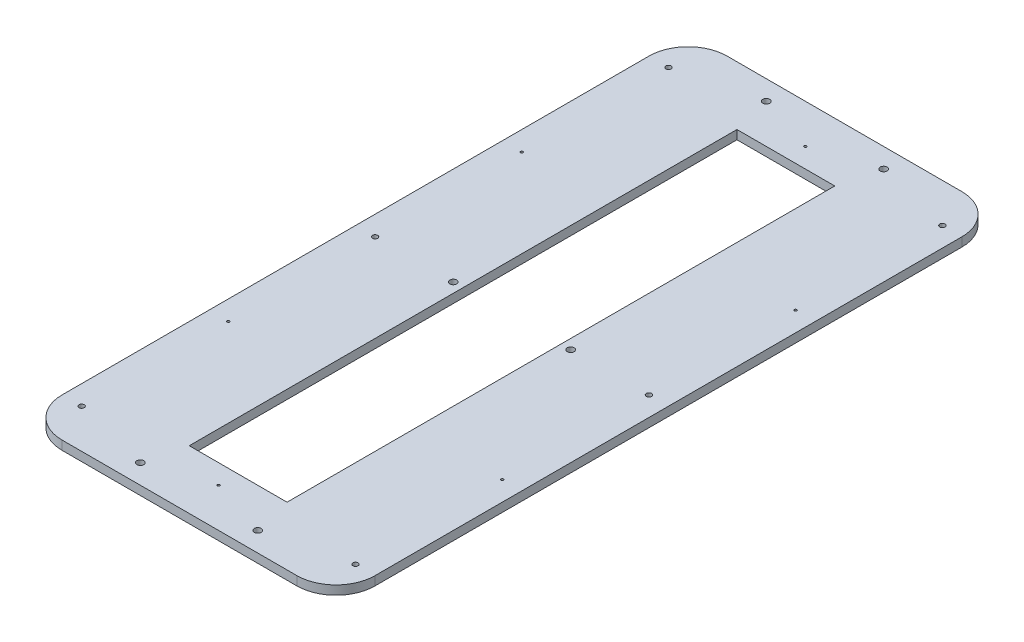
ISO-10303-21;
HEADER;
FILE_DESCRIPTION(('STEP AP214'),'2;1');
FILE_NAME('part.step','',(''),(''),'','','');
FILE_SCHEMA(('AUTOMOTIVE_DESIGN { 1 0 10303 214 1 1 1 1 }'));
ENDSEC;
DATA;
#1=APPLICATION_CONTEXT('core data for automotive mechanical design processes');
#2=APPLICATION_PROTOCOL_DEFINITION('international standard','automotive_design',2000,#1);
#3=PRODUCT_CONTEXT('',#1,'mechanical');
#4=PRODUCT('Part','Part','',(#3));
#5=PRODUCT_RELATED_PRODUCT_CATEGORY('part','',(#4));
#6=PRODUCT_DEFINITION_FORMATION('','',#4);
#7=PRODUCT_DEFINITION_CONTEXT('part definition',#1,'design');
#8=PRODUCT_DEFINITION('design','',#6,#7);
#9=PRODUCT_DEFINITION_SHAPE('','',#8);
#10=(LENGTH_UNIT() NAMED_UNIT(*) SI_UNIT(.MILLI.,.METRE.));
#11=(NAMED_UNIT(*) PLANE_ANGLE_UNIT() SI_UNIT($,.RADIAN.));
#12=(NAMED_UNIT(*) SI_UNIT($,.STERADIAN.) SOLID_ANGLE_UNIT());
#13=UNCERTAINTY_MEASURE_WITH_UNIT(LENGTH_MEASURE(1.E-05),#10,'distance_accuracy_value','');
#14=(GEOMETRIC_REPRESENTATION_CONTEXT(3) GLOBAL_UNCERTAINTY_ASSIGNED_CONTEXT((#13)) GLOBAL_UNIT_ASSIGNED_CONTEXT((#10,
#11,#12)) REPRESENTATION_CONTEXT('',''));
#15=CARTESIAN_POINT('',(0.,0.,0.));
#16=DIRECTION('',(0.,0.,1.));
#17=DIRECTION('',(1.,0.,0.));
#18=AXIS2_PLACEMENT_3D('',#15,#16,#17);
#19=CARTESIAN_POINT('',(0.,5.8,0.));
#20=DIRECTION('',(1.,0.,0.));
#21=DIRECTION('',(0.,0.,-1.));
#22=AXIS2_PLACEMENT_3D('',#19,#20,#21);
#23=PLANE('',#22);
#24=DIRECTION('',(0.,0.,1.));
#25=VECTOR('',#24,1.);
#26=CARTESIAN_POINT('',(0.,5.8,0.));
#27=LINE('',#26,#25);
#28=CARTESIAN_POINT('',(0.,5.8,-406.4));
#29=VERTEX_POINT('',#28);
#30=CARTESIAN_POINT('',(0.,5.8,-25.4));
#31=VERTEX_POINT('',#30);
#32=EDGE_CURVE('E197',#29,#31,#27,.T.);
#33=ORIENTED_EDGE('',*,*,#32,.F.);
#34=DIRECTION('',(0.,-1.,0.));
#35=VECTOR('',#34,1.);
#36=CARTESIAN_POINT('',(0.,5.8,-406.4));
#37=LINE('',#36,#35);
#38=CARTESIAN_POINT('',(0.,0.,-406.4));
#39=VERTEX_POINT('',#38);
#40=EDGE_CURVE('E254',#29,#39,#37,.T.);
#41=ORIENTED_EDGE('',*,*,#40,.T.);
#42=DIRECTION('',(0.,0.,1.));
#43=VECTOR('',#42,1.);
#44=CARTESIAN_POINT('',(0.,0.,0.));
#45=LINE('',#44,#43);
#46=CARTESIAN_POINT('',(0.,0.,-25.4));
#47=VERTEX_POINT('',#46);
#48=EDGE_CURVE('E196',#39,#47,#45,.T.);
#49=ORIENTED_EDGE('',*,*,#48,.T.);
#50=DIRECTION('',(0.,-1.,0.));
#51=VECTOR('',#50,1.);
#52=CARTESIAN_POINT('',(0.,5.8,-25.4));
#53=LINE('',#52,#51);
#54=EDGE_CURVE('E252',#47,#31,#53,.F.);
#55=ORIENTED_EDGE('',*,*,#54,.T.);
#56=EDGE_LOOP('',(#33,#41,#49,#55));
#57=FACE_BOUND('',#56,.T.);
#58=ADVANCED_FACE('F32',(#57),#23,.F.);
#59=CARTESIAN_POINT('',(0.,5.8,0.));
#60=DIRECTION('',(0.,0.,-1.));
#61=DIRECTION('',(-1.,0.,0.));
#62=AXIS2_PLACEMENT_3D('',#59,#60,#61);
#63=PLANE('',#62);
#64=DIRECTION('',(1.,0.,0.));
#65=VECTOR('',#64,1.);
#66=CARTESIAN_POINT('',(0.,0.,0.));
#67=LINE('',#66,#65);
#68=CARTESIAN_POINT('',(25.4,0.,0.));
#69=VERTEX_POINT('',#68);
#70=CARTESIAN_POINT('',(177.8,0.,0.));
#71=VERTEX_POINT('',#70);
#72=EDGE_CURVE('E211',#69,#71,#67,.T.);
#73=ORIENTED_EDGE('',*,*,#72,.T.);
#74=DIRECTION('',(0.,-1.,0.));
#75=VECTOR('',#74,1.);
#76=CARTESIAN_POINT('',(177.8,5.8,0.));
#77=LINE('',#76,#75);
#78=CARTESIAN_POINT('',(177.8,5.8,0.));
#79=VERTEX_POINT('',#78);
#80=EDGE_CURVE('E11',#71,#79,#77,.F.);
#81=ORIENTED_EDGE('',*,*,#80,.T.);
#82=DIRECTION('',(1.,0.,0.));
#83=VECTOR('',#82,1.);
#84=CARTESIAN_POINT('',(0.,5.8,0.));
#85=LINE('',#84,#83);
#86=CARTESIAN_POINT('',(25.4,5.8,0.));
#87=VERTEX_POINT('',#86);
#88=EDGE_CURVE('E199',#87,#79,#85,.T.);
#89=ORIENTED_EDGE('',*,*,#88,.F.);
#90=DIRECTION('',(0.,-1.,0.));
#91=VECTOR('',#90,1.);
#92=CARTESIAN_POINT('',(25.4,5.8,0.));
#93=LINE('',#92,#91);
#94=EDGE_CURVE('E41',#87,#69,#93,.T.);
#95=ORIENTED_EDGE('',*,*,#94,.T.);
#96=EDGE_LOOP('',(#73,#81,#89,#95));
#97=FACE_BOUND('',#96,.T.);
#98=ADVANCED_FACE('F342',(#97),#63,.F.);
#99=CARTESIAN_POINT('',(203.2,5.8,0.));
#100=DIRECTION('',(-1.,0.,0.));
#101=DIRECTION('',(0.,0.,1.));
#102=AXIS2_PLACEMENT_3D('',#99,#100,#101);
#103=PLANE('',#102);
#104=DIRECTION('',(0.,0.,-1.));
#105=VECTOR('',#104,1.);
#106=CARTESIAN_POINT('',(203.2,0.,0.));
#107=LINE('',#106,#105);
#108=CARTESIAN_POINT('',(203.2,0.,-25.4));
#109=VERTEX_POINT('',#108);
#110=CARTESIAN_POINT('',(203.2,0.,-406.4));
#111=VERTEX_POINT('',#110);
#112=EDGE_CURVE('E213',#109,#111,#107,.T.);
#113=ORIENTED_EDGE('',*,*,#112,.T.);
#114=DIRECTION('',(0.,-1.,0.));
#115=VECTOR('',#114,1.);
#116=CARTESIAN_POINT('',(203.2,5.8,-406.4));
#117=LINE('',#116,#115);
#118=CARTESIAN_POINT('',(203.2,5.8,-406.4));
#119=VERTEX_POINT('',#118);
#120=EDGE_CURVE('E243',#111,#119,#117,.F.);
#121=ORIENTED_EDGE('',*,*,#120,.T.);
#122=DIRECTION('',(0.,0.,-1.));
#123=VECTOR('',#122,1.);
#124=CARTESIAN_POINT('',(203.2,5.8,0.));
#125=LINE('',#124,#123);
#126=CARTESIAN_POINT('',(203.2,5.8,-25.4));
#127=VERTEX_POINT('',#126);
#128=EDGE_CURVE('E202',#127,#119,#125,.T.);
#129=ORIENTED_EDGE('',*,*,#128,.F.);
#130=DIRECTION('',(0.,-1.,0.));
#131=VECTOR('',#130,1.);
#132=CARTESIAN_POINT('',(203.2,5.8,-25.4));
#133=LINE('',#132,#131);
#134=EDGE_CURVE('E240',#127,#109,#133,.T.);
#135=ORIENTED_EDGE('',*,*,#134,.T.);
#136=EDGE_LOOP('',(#113,#121,#129,#135));
#137=FACE_BOUND('',#136,.T.);
#138=ADVANCED_FACE('F345',(#137),#103,.F.);
#139=CARTESIAN_POINT('',(0.,5.8,-431.8));
#140=DIRECTION('',(0.,0.,1.));
#141=DIRECTION('',(1.,0.,0.));
#142=AXIS2_PLACEMENT_3D('',#139,#140,#141);
#143=PLANE('',#142);
#144=DIRECTION('',(-1.,0.,0.));
#145=VECTOR('',#144,1.);
#146=CARTESIAN_POINT('',(0.,5.8,-431.8));
#147=LINE('',#146,#145);
#148=CARTESIAN_POINT('',(177.8,5.8,-431.8));
#149=VERTEX_POINT('',#148);
#150=CARTESIAN_POINT('',(25.4,5.8,-431.8));
#151=VERTEX_POINT('',#150);
#152=EDGE_CURVE('E205',#149,#151,#147,.T.);
#153=ORIENTED_EDGE('',*,*,#152,.F.);
#154=DIRECTION('',(0.,-1.,0.));
#155=VECTOR('',#154,1.);
#156=CARTESIAN_POINT('',(177.8,5.8,-431.8));
#157=LINE('',#156,#155);
#158=CARTESIAN_POINT('',(177.8,0.,-431.8));
#159=VERTEX_POINT('',#158);
#160=EDGE_CURVE('E229',#149,#159,#157,.T.);
#161=ORIENTED_EDGE('',*,*,#160,.T.);
#162=DIRECTION('',(-1.,0.,0.));
#163=VECTOR('',#162,1.);
#164=CARTESIAN_POINT('',(0.,0.,-431.8));
#165=LINE('',#164,#163);
#166=CARTESIAN_POINT('',(25.4,0.,-431.8));
#167=VERTEX_POINT('',#166);
#168=EDGE_CURVE('E200',#159,#167,#165,.T.);
#169=ORIENTED_EDGE('',*,*,#168,.T.);
#170=DIRECTION('',(0.,-1.,0.));
#171=VECTOR('',#170,1.);
#172=CARTESIAN_POINT('',(25.4,5.8,-431.8));
#173=LINE('',#172,#171);
#174=EDGE_CURVE('E208',#167,#151,#173,.F.);
#175=ORIENTED_EDGE('',*,*,#174,.T.);
#176=EDGE_LOOP('',(#153,#161,#169,#175));
#177=FACE_BOUND('',#176,.T.);
#178=ADVANCED_FACE('F300',(#177),#143,.F.);
#179=CARTESIAN_POINT('',(0.,5.8,-431.8));
#180=DIRECTION('',(0.,-1.,0.));
#181=DIRECTION('',(0.,0.,-1.));
#182=AXIS2_PLACEMENT_3D('',#179,#180,#181);
#183=PLANE('',#182);
#184=CARTESIAN_POINT('',(190.5,5.8,-311.15));
#185=DIRECTION('',(0.,1.,0.));
#186=DIRECTION('',(0.,0.,-1.));
#187=AXIS2_PLACEMENT_3D('',#184,#185,#186);
#188=CIRCLE('',#187,0.793750000000054);
#189=CARTESIAN_POINT('',(190.5,5.8,-311.94375));
#190=VERTEX_POINT('',#189);
#191=EDGE_CURVE('E502',#190,#190,#188,.T.);
#192=ORIENTED_EDGE('',*,*,#191,.F.);
#193=EDGE_LOOP('',(#192));
#194=FACE_BOUND('',#193,.T.);
#195=CARTESIAN_POINT('',(12.6999999999999,5.8,-311.15));
#196=DIRECTION('',(0.,1.,0.));
#197=DIRECTION('',(0.,0.,-1.));
#198=AXIS2_PLACEMENT_3D('',#195,#196,#197);
#199=CIRCLE('',#198,0.793750000000021);
#200=CARTESIAN_POINT('',(12.6999999999999,5.8,-311.94375));
#201=VERTEX_POINT('',#200);
#202=EDGE_CURVE('E504',#201,#201,#199,.T.);
#203=ORIENTED_EDGE('',*,*,#202,.F.);
#204=EDGE_LOOP('',(#203));
#205=FACE_BOUND('',#204,.T.);
#206=CARTESIAN_POINT('',(101.6,5.8,-406.4));
#207=DIRECTION('',(0.,1.,0.));
#208=DIRECTION('',(0.,0.,-1.));
#209=AXIS2_PLACEMENT_3D('',#206,#207,#208);
#210=CIRCLE('',#209,0.793750000000027);
#211=CARTESIAN_POINT('',(101.6,5.8,-407.19375));
#212=VERTEX_POINT('',#211);
#213=EDGE_CURVE('E508',#212,#212,#210,.T.);
#214=ORIENTED_EDGE('',*,*,#213,.F.);
#215=EDGE_LOOP('',(#214));
#216=FACE_BOUND('',#215,.T.);
#217=CARTESIAN_POINT('',(101.6,5.8,-25.4));
#218=DIRECTION('',(0.,1.,0.));
#219=DIRECTION('',(0.,0.,1.));
#220=AXIS2_PLACEMENT_3D('',#217,#218,#219);
#221=CIRCLE('',#220,0.793749999999993);
#222=CARTESIAN_POINT('',(101.6,5.8,-24.60625));
#223=VERTEX_POINT('',#222);
#224=EDGE_CURVE('E512',#223,#223,#221,.T.);
#225=ORIENTED_EDGE('',*,*,#224,.F.);
#226=EDGE_LOOP('',(#225));
#227=FACE_BOUND('',#226,.T.);
#228=CARTESIAN_POINT('',(12.6999999999999,5.8,-120.65));
#229=DIRECTION('',(0.,1.,0.));
#230=DIRECTION('',(0.,0.,1.));
#231=AXIS2_PLACEMENT_3D('',#228,#229,#230);
#232=CIRCLE('',#231,0.793749999999999);
#233=CARTESIAN_POINT('',(12.6999999999999,5.8,-119.85625));
#234=VERTEX_POINT('',#233);
#235=EDGE_CURVE('E516',#234,#234,#232,.T.);
#236=ORIENTED_EDGE('',*,*,#235,.F.);
#237=EDGE_LOOP('',(#236));
#238=FACE_BOUND('',#237,.T.);
#239=CARTESIAN_POINT('',(190.5,5.8,-120.65));
#240=DIRECTION('',(0.,1.,0.));
#241=DIRECTION('',(0.,0.,1.));
#242=AXIS2_PLACEMENT_3D('',#239,#240,#241);
#243=CIRCLE('',#242,0.793750000000019);
#244=CARTESIAN_POINT('',(190.5,5.8,-119.85625));
#245=VERTEX_POINT('',#244);
#246=EDGE_CURVE('E520',#245,#245,#243,.T.);
#247=ORIENTED_EDGE('',*,*,#246,.F.);
#248=EDGE_LOOP('',(#247));
#249=FACE_BOUND('',#248,.T.);
#250=CARTESIAN_POINT('',(190.5,5.8,-406.4));
#251=DIRECTION('',(0.,1.,0.));
#252=DIRECTION('',(0.,0.,1.));
#253=AXIS2_PLACEMENT_3D('',#250,#251,#252);
#254=CIRCLE('',#253,1.70000000000001);
#255=CARTESIAN_POINT('',(190.5,5.8,-404.7));
#256=VERTEX_POINT('',#255);
#257=EDGE_CURVE('E281',#256,#256,#254,.T.);
#258=ORIENTED_EDGE('',*,*,#257,.F.);
#259=EDGE_LOOP('',(#258));
#260=FACE_BOUND('',#259,.T.);
#261=CARTESIAN_POINT('',(190.5,5.8,-25.4));
#262=DIRECTION('',(0.,1.,0.));
#263=DIRECTION('',(0.,0.,1.));
#264=AXIS2_PLACEMENT_3D('',#261,#262,#263);
#265=CIRCLE('',#264,1.70000000000001);
#266=CARTESIAN_POINT('',(190.5,5.8,-23.7));
#267=VERTEX_POINT('',#266);
#268=EDGE_CURVE('E271',#267,#267,#265,.T.);
#269=ORIENTED_EDGE('',*,*,#268,.F.);
#270=EDGE_LOOP('',(#269));
#271=FACE_BOUND('',#270,.T.);
#272=CARTESIAN_POINT('',(12.7,5.8,-25.4));
#273=DIRECTION('',(0.,1.,0.));
#274=DIRECTION('',(0.,0.,1.));
#275=AXIS2_PLACEMENT_3D('',#272,#273,#274);
#276=CIRCLE('',#275,1.7);
#277=CARTESIAN_POINT('',(12.7,5.8,-23.7));
#278=VERTEX_POINT('',#277);
#279=EDGE_CURVE('E268',#278,#278,#276,.T.);
#280=ORIENTED_EDGE('',*,*,#279,.F.);
#281=EDGE_LOOP('',(#280));
#282=FACE_BOUND('',#281,.T.);
#283=CARTESIAN_POINT('',(12.7,5.8,-406.4));
#284=DIRECTION('',(0.,1.,0.));
#285=DIRECTION('',(0.,0.,1.));
#286=AXIS2_PLACEMENT_3D('',#283,#284,#285);
#287=CIRCLE('',#286,1.7);
#288=CARTESIAN_POINT('',(12.7,5.8,-404.7));
#289=VERTEX_POINT('',#288);
#290=EDGE_CURVE('E265',#289,#289,#287,.T.);
#291=ORIENTED_EDGE('',*,*,#290,.F.);
#292=EDGE_LOOP('',(#291));
#293=FACE_BOUND('',#292,.T.);
#294=CARTESIAN_POINT('',(190.5,5.8,-215.9));
#295=DIRECTION('',(0.,1.,0.));
#296=DIRECTION('',(0.,0.,1.));
#297=AXIS2_PLACEMENT_3D('',#294,#295,#296);
#298=CIRCLE('',#297,1.70000000000001);
#299=CARTESIAN_POINT('',(190.5,5.8,-214.2));
#300=VERTEX_POINT('',#299);
#301=EDGE_CURVE('E264',#300,#300,#298,.T.);
#302=ORIENTED_EDGE('',*,*,#301,.F.);
#303=EDGE_LOOP('',(#302));
#304=FACE_BOUND('',#303,.T.);
#305=CARTESIAN_POINT('',(12.7,5.8,-215.9));
#306=DIRECTION('',(0.,1.,0.));
#307=DIRECTION('',(0.,0.,1.));
#308=AXIS2_PLACEMENT_3D('',#305,#306,#307);
#309=CIRCLE('',#308,1.7);
#310=CARTESIAN_POINT('',(12.7,5.8,-214.2));
#311=VERTEX_POINT('',#310);
#312=EDGE_CURVE('E154',#311,#311,#309,.T.);
#313=ORIENTED_EDGE('',*,*,#312,.F.);
#314=EDGE_LOOP('',(#313));
#315=FACE_BOUND('',#314,.T.);
#316=DIRECTION('',(1.,0.,0.));
#317=VECTOR('',#316,1.);
#318=CARTESIAN_POINT('',(69.85,5.8,-38.1));
#319=LINE('',#318,#317);
#320=CARTESIAN_POINT('',(69.85,5.8,-38.1));
#321=VERTEX_POINT('',#320);
#322=CARTESIAN_POINT('',(133.35,5.8,-38.1));
#323=VERTEX_POINT('',#322);
#324=EDGE_CURVE('E160',#321,#323,#319,.T.);
#325=ORIENTED_EDGE('',*,*,#324,.F.);
#326=DIRECTION('',(0.,0.,1.));
#327=VECTOR('',#326,1.);
#328=CARTESIAN_POINT('',(69.85,5.8,-393.7));
#329=LINE('',#328,#327);
#330=CARTESIAN_POINT('',(69.85,5.8,-393.7));
#331=VERTEX_POINT('',#330);
#332=EDGE_CURVE('E130',#331,#321,#329,.T.);
#333=ORIENTED_EDGE('',*,*,#332,.F.);
#334=DIRECTION('',(-1.,0.,0.));
#335=VECTOR('',#334,1.);
#336=CARTESIAN_POINT('',(69.85,5.8,-393.7));
#337=LINE('',#336,#335);
#338=CARTESIAN_POINT('',(133.35,5.8,-393.7));
#339=VERTEX_POINT('',#338);
#340=EDGE_CURVE('E148',#339,#331,#337,.T.);
#341=ORIENTED_EDGE('',*,*,#340,.F.);
#342=DIRECTION('',(0.,0.,-1.));
#343=VECTOR('',#342,1.);
#344=CARTESIAN_POINT('',(133.35,5.8,-393.7));
#345=LINE('',#344,#343);
#346=EDGE_CURVE('E151',#323,#339,#345,.T.);
#347=ORIENTED_EDGE('',*,*,#346,.F.);
#348=EDGE_LOOP('',(#325,#333,#341,#347));
#349=FACE_BOUND('',#348,.T.);
#350=CARTESIAN_POINT('',(63.5,5.8,-419.1));
#351=DIRECTION('',(0.,1.,0.));
#352=DIRECTION('',(0.,0.,1.));
#353=AXIS2_PLACEMENT_3D('',#350,#351,#352);
#354=CIRCLE('',#353,2.24999999999999);
#355=CARTESIAN_POINT('',(63.5,5.8,-416.85));
#356=VERTEX_POINT('',#355);
#357=EDGE_CURVE('E167',#356,#356,#354,.T.);
#358=ORIENTED_EDGE('',*,*,#357,.F.);
#359=EDGE_LOOP('',(#358));
#360=FACE_BOUND('',#359,.T.);
#361=CARTESIAN_POINT('',(139.7,5.8,-419.1));
#362=DIRECTION('',(0.,1.,0.));
#363=DIRECTION('',(0.,0.,1.));
#364=AXIS2_PLACEMENT_3D('',#361,#362,#363);
#365=CIRCLE('',#364,2.25);
#366=CARTESIAN_POINT('',(139.7,5.8,-416.85));
#367=VERTEX_POINT('',#366);
#368=EDGE_CURVE('E174',#367,#367,#365,.T.);
#369=ORIENTED_EDGE('',*,*,#368,.F.);
#370=EDGE_LOOP('',(#369));
#371=FACE_BOUND('',#370,.T.);
#372=CARTESIAN_POINT('',(63.5,5.8,-215.9));
#373=DIRECTION('',(0.,1.,0.));
#374=DIRECTION('',(0.,0.,1.));
#375=AXIS2_PLACEMENT_3D('',#372,#373,#374);
#376=CIRCLE('',#375,2.24999999999999);
#377=CARTESIAN_POINT('',(63.5,5.8,-213.65));
#378=VERTEX_POINT('',#377);
#379=EDGE_CURVE('E178',#378,#378,#376,.T.);
#380=ORIENTED_EDGE('',*,*,#379,.F.);
#381=EDGE_LOOP('',(#380));
#382=FACE_BOUND('',#381,.T.);
#383=CARTESIAN_POINT('',(139.7,5.8,-215.9));
#384=DIRECTION('',(0.,1.,0.));
#385=DIRECTION('',(0.,0.,1.));
#386=AXIS2_PLACEMENT_3D('',#383,#384,#385);
#387=CIRCLE('',#386,2.25);
#388=CARTESIAN_POINT('',(139.7,5.8,-213.65));
#389=VERTEX_POINT('',#388);
#390=EDGE_CURVE('E182',#389,#389,#387,.T.);
#391=ORIENTED_EDGE('',*,*,#390,.F.);
#392=EDGE_LOOP('',(#391));
#393=FACE_BOUND('',#392,.T.);
#394=CARTESIAN_POINT('',(63.5,5.8,-12.7));
#395=DIRECTION('',(0.,1.,0.));
#396=DIRECTION('',(0.,0.,1.));
#397=AXIS2_PLACEMENT_3D('',#394,#395,#396);
#398=CIRCLE('',#397,2.24999999999999);
#399=CARTESIAN_POINT('',(63.5,5.8,-10.45));
#400=VERTEX_POINT('',#399);
#401=EDGE_CURVE('E186',#400,#400,#398,.T.);
#402=ORIENTED_EDGE('',*,*,#401,.F.);
#403=EDGE_LOOP('',(#402));
#404=FACE_BOUND('',#403,.T.);
#405=CARTESIAN_POINT('',(139.7,5.8,-12.7));
#406=DIRECTION('',(0.,1.,0.));
#407=DIRECTION('',(0.,0.,1.));
#408=AXIS2_PLACEMENT_3D('',#405,#406,#407);
#409=CIRCLE('',#408,2.25);
#410=CARTESIAN_POINT('',(139.7,5.8,-10.45));
#411=VERTEX_POINT('',#410);
#412=EDGE_CURVE('E190',#411,#411,#409,.T.);
#413=ORIENTED_EDGE('',*,*,#412,.F.);
#414=EDGE_LOOP('',(#413));
#415=FACE_BOUND('',#414,.T.);
#416=ORIENTED_EDGE('',*,*,#128,.T.);
#417=CARTESIAN_POINT('',(177.8,5.8,-406.4));
#418=DIRECTION('',(0.,-1.,0.));
#419=DIRECTION('',(0.,0.,-1.));
#420=AXIS2_PLACEMENT_3D('',#417,#418,#419);
#421=CIRCLE('',#420,25.4);
#422=EDGE_CURVE('E250',#119,#149,#421,.F.);
#423=ORIENTED_EDGE('',*,*,#422,.T.);
#424=ORIENTED_EDGE('',*,*,#152,.T.);
#425=CARTESIAN_POINT('',(25.4,5.8,-406.4));
#426=DIRECTION('',(0.,-1.,0.));
#427=DIRECTION('',(0.,0.,-1.));
#428=AXIS2_PLACEMENT_3D('',#425,#426,#427);
#429=CIRCLE('',#428,25.4);
#430=EDGE_CURVE('E248',#151,#29,#429,.F.);
#431=ORIENTED_EDGE('',*,*,#430,.T.);
#432=ORIENTED_EDGE('',*,*,#32,.T.);
#433=CARTESIAN_POINT('',(25.4,5.8,-25.4));
#434=DIRECTION('',(0.,-1.,0.));
#435=DIRECTION('',(0.,0.,-1.));
#436=AXIS2_PLACEMENT_3D('',#433,#434,#435);
#437=CIRCLE('',#436,25.4);
#438=EDGE_CURVE('E54',#31,#87,#437,.F.);
#439=ORIENTED_EDGE('',*,*,#438,.T.);
#440=ORIENTED_EDGE('',*,*,#88,.T.);
#441=CARTESIAN_POINT('',(177.8,5.8,-25.4));
#442=DIRECTION('',(0.,-1.,0.));
#443=DIRECTION('',(0.,0.,-1.));
#444=AXIS2_PLACEMENT_3D('',#441,#442,#443);
#445=CIRCLE('',#444,25.4);
#446=EDGE_CURVE('E246',#79,#127,#445,.F.);
#447=ORIENTED_EDGE('',*,*,#446,.T.);
#448=EDGE_LOOP('',(#416,#423,#424,#431,#432,#439,#440,#447));
#449=FACE_BOUND('',#448,.T.);
#450=ADVANCED_FACE('F297',(#194,#205,#216,#227,#238,#249,#260,#271,#282,#293,#304,#315,#349,
#360,#371,#382,#393,#404,#415,#449),#183,.F.);
#451=CARTESIAN_POINT('',(0.,0.,-431.8));
#452=DIRECTION('',(0.,-1.,0.));
#453=DIRECTION('',(0.,0.,-1.));
#454=AXIS2_PLACEMENT_3D('',#451,#452,#453);
#455=PLANE('',#454);
#456=CARTESIAN_POINT('',(190.5,0.,-311.15));
#457=DIRECTION('',(0.,1.,0.));
#458=DIRECTION('',(0.,0.,-1.));
#459=AXIS2_PLACEMENT_3D('',#456,#457,#458);
#460=CIRCLE('',#459,0.793750000000054);
#461=CARTESIAN_POINT('',(190.5,0.,-311.94375));
#462=VERTEX_POINT('',#461);
#463=EDGE_CURVE('E422',#462,#462,#460,.T.);
#464=ORIENTED_EDGE('',*,*,#463,.T.);
#465=EDGE_LOOP('',(#464));
#466=FACE_BOUND('',#465,.T.);
#467=CARTESIAN_POINT('',(12.6999999999999,0.,-311.15));
#468=DIRECTION('',(0.,1.,0.));
#469=DIRECTION('',(0.,0.,-1.));
#470=AXIS2_PLACEMENT_3D('',#467,#468,#469);
#471=CIRCLE('',#470,0.793750000000021);
#472=CARTESIAN_POINT('',(12.6999999999999,0.,-311.94375));
#473=VERTEX_POINT('',#472);
#474=EDGE_CURVE('E426',#473,#473,#471,.T.);
#475=ORIENTED_EDGE('',*,*,#474,.T.);
#476=EDGE_LOOP('',(#475));
#477=FACE_BOUND('',#476,.T.);
#478=CARTESIAN_POINT('',(101.6,0.,-406.4));
#479=DIRECTION('',(0.,1.,0.));
#480=DIRECTION('',(0.,0.,-1.));
#481=AXIS2_PLACEMENT_3D('',#478,#479,#480);
#482=CIRCLE('',#481,0.793750000000027);
#483=CARTESIAN_POINT('',(101.6,0.,-407.19375));
#484=VERTEX_POINT('',#483);
#485=EDGE_CURVE('E430',#484,#484,#482,.T.);
#486=ORIENTED_EDGE('',*,*,#485,.T.);
#487=EDGE_LOOP('',(#486));
#488=FACE_BOUND('',#487,.T.);
#489=CARTESIAN_POINT('',(101.6,0.,-25.4));
#490=DIRECTION('',(0.,1.,0.));
#491=DIRECTION('',(0.,0.,1.));
#492=AXIS2_PLACEMENT_3D('',#489,#490,#491);
#493=CIRCLE('',#492,0.793749999999993);
#494=CARTESIAN_POINT('',(101.6,0.,-24.60625));
#495=VERTEX_POINT('',#494);
#496=EDGE_CURVE('E434',#495,#495,#493,.T.);
#497=ORIENTED_EDGE('',*,*,#496,.T.);
#498=EDGE_LOOP('',(#497));
#499=FACE_BOUND('',#498,.T.);
#500=CARTESIAN_POINT('',(12.6999999999999,0.,-120.65));
#501=DIRECTION('',(0.,1.,0.));
#502=DIRECTION('',(0.,0.,1.));
#503=AXIS2_PLACEMENT_3D('',#500,#501,#502);
#504=CIRCLE('',#503,0.793749999999999);
#505=CARTESIAN_POINT('',(12.6999999999999,0.,-119.85625));
#506=VERTEX_POINT('',#505);
#507=EDGE_CURVE('E438',#506,#506,#504,.T.);
#508=ORIENTED_EDGE('',*,*,#507,.T.);
#509=EDGE_LOOP('',(#508));
#510=FACE_BOUND('',#509,.T.);
#511=CARTESIAN_POINT('',(190.5,0.,-120.65));
#512=DIRECTION('',(0.,1.,0.));
#513=DIRECTION('',(0.,0.,1.));
#514=AXIS2_PLACEMENT_3D('',#511,#512,#513);
#515=CIRCLE('',#514,0.793750000000019);
#516=CARTESIAN_POINT('',(190.5,0.,-119.85625));
#517=VERTEX_POINT('',#516);
#518=EDGE_CURVE('E442',#517,#517,#515,.T.);
#519=ORIENTED_EDGE('',*,*,#518,.T.);
#520=EDGE_LOOP('',(#519));
#521=FACE_BOUND('',#520,.T.);
#522=CARTESIAN_POINT('',(190.5,0.,-406.4));
#523=DIRECTION('',(0.,-1.,0.));
#524=DIRECTION('',(0.,0.,-1.));
#525=AXIS2_PLACEMENT_3D('',#522,#523,#524);
#526=CIRCLE('',#525,1.70000000000001);
#527=CARTESIAN_POINT('',(190.5,0.,-408.1));
#528=VERTEX_POINT('',#527);
#529=EDGE_CURVE('E36',#528,#528,#526,.T.);
#530=ORIENTED_EDGE('',*,*,#529,.F.);
#531=EDGE_LOOP('',(#530));
#532=FACE_BOUND('',#531,.T.);
#533=CARTESIAN_POINT('',(190.5,0.,-25.4));
#534=DIRECTION('',(0.,-1.,0.));
#535=DIRECTION('',(0.,0.,-1.));
#536=AXIS2_PLACEMENT_3D('',#533,#534,#535);
#537=CIRCLE('',#536,1.70000000000001);
#538=CARTESIAN_POINT('',(190.5,0.,-27.1));
#539=VERTEX_POINT('',#538);
#540=EDGE_CURVE('E269',#539,#539,#537,.T.);
#541=ORIENTED_EDGE('',*,*,#540,.F.);
#542=EDGE_LOOP('',(#541));
#543=FACE_BOUND('',#542,.T.);
#544=CARTESIAN_POINT('',(12.7,0.,-25.4));
#545=DIRECTION('',(0.,-1.,0.));
#546=DIRECTION('',(0.,0.,-1.));
#547=AXIS2_PLACEMENT_3D('',#544,#545,#546);
#548=CIRCLE('',#547,1.7);
#549=CARTESIAN_POINT('',(12.7,0.,-27.1));
#550=VERTEX_POINT('',#549);
#551=EDGE_CURVE('E266',#550,#550,#548,.T.);
#552=ORIENTED_EDGE('',*,*,#551,.F.);
#553=EDGE_LOOP('',(#552));
#554=FACE_BOUND('',#553,.T.);
#555=CARTESIAN_POINT('',(12.7,0.,-406.4));
#556=DIRECTION('',(0.,-1.,0.));
#557=DIRECTION('',(0.,0.,-1.));
#558=AXIS2_PLACEMENT_3D('',#555,#556,#557);
#559=CIRCLE('',#558,1.7);
#560=CARTESIAN_POINT('',(12.7,0.,-408.1));
#561=VERTEX_POINT('',#560);
#562=EDGE_CURVE('E261',#561,#561,#559,.T.);
#563=ORIENTED_EDGE('',*,*,#562,.F.);
#564=EDGE_LOOP('',(#563));
#565=FACE_BOUND('',#564,.T.);
#566=CARTESIAN_POINT('',(190.5,0.,-215.9));
#567=DIRECTION('',(0.,-1.,0.));
#568=DIRECTION('',(0.,0.,-1.));
#569=AXIS2_PLACEMENT_3D('',#566,#567,#568);
#570=CIRCLE('',#569,1.70000000000001);
#571=CARTESIAN_POINT('',(190.5,0.,-217.6));
#572=VERTEX_POINT('',#571);
#573=EDGE_CURVE('E288',#572,#572,#570,.T.);
#574=ORIENTED_EDGE('',*,*,#573,.F.);
#575=EDGE_LOOP('',(#574));
#576=FACE_BOUND('',#575,.T.);
#577=CARTESIAN_POINT('',(12.7,0.,-215.9));
#578=DIRECTION('',(0.,-1.,0.));
#579=DIRECTION('',(0.,0.,-1.));
#580=AXIS2_PLACEMENT_3D('',#577,#578,#579);
#581=CIRCLE('',#580,1.7);
#582=CARTESIAN_POINT('',(12.7,0.,-217.6));
#583=VERTEX_POINT('',#582);
#584=EDGE_CURVE('E161',#583,#583,#581,.T.);
#585=ORIENTED_EDGE('',*,*,#584,.F.);
#586=EDGE_LOOP('',(#585));
#587=FACE_BOUND('',#586,.T.);
#588=DIRECTION('',(0.,0.,1.));
#589=VECTOR('',#588,1.);
#590=CARTESIAN_POINT('',(69.85,0.,-393.7));
#591=LINE('',#590,#589);
#592=CARTESIAN_POINT('',(69.85,0.,-393.7));
#593=VERTEX_POINT('',#592);
#594=CARTESIAN_POINT('',(69.85,0.,-38.1));
#595=VERTEX_POINT('',#594);
#596=EDGE_CURVE('E127',#593,#595,#591,.T.);
#597=ORIENTED_EDGE('',*,*,#596,.T.);
#598=DIRECTION('',(1.,0.,0.));
#599=VECTOR('',#598,1.);
#600=CARTESIAN_POINT('',(69.85,0.,-38.1));
#601=LINE('',#600,#599);
#602=CARTESIAN_POINT('',(133.35,0.,-38.1));
#603=VERTEX_POINT('',#602);
#604=EDGE_CURVE('E139',#595,#603,#601,.T.);
#605=ORIENTED_EDGE('',*,*,#604,.T.);
#606=DIRECTION('',(0.,0.,-1.));
#607=VECTOR('',#606,1.);
#608=CARTESIAN_POINT('',(133.35,0.,-393.7));
#609=LINE('',#608,#607);
#610=CARTESIAN_POINT('',(133.35,0.,-393.7));
#611=VERTEX_POINT('',#610);
#612=EDGE_CURVE('E143',#603,#611,#609,.T.);
#613=ORIENTED_EDGE('',*,*,#612,.T.);
#614=DIRECTION('',(-1.,0.,0.));
#615=VECTOR('',#614,1.);
#616=CARTESIAN_POINT('',(69.85,0.,-393.7));
#617=LINE('',#616,#615);
#618=EDGE_CURVE('E135',#611,#593,#617,.T.);
#619=ORIENTED_EDGE('',*,*,#618,.T.);
#620=EDGE_LOOP('',(#597,#605,#613,#619));
#621=FACE_BOUND('',#620,.T.);
#622=CARTESIAN_POINT('',(63.5,0.,-419.1));
#623=DIRECTION('',(0.,-1.,0.));
#624=DIRECTION('',(0.,0.,-1.));
#625=AXIS2_PLACEMENT_3D('',#622,#623,#624);
#626=CIRCLE('',#625,2.24999999999999);
#627=CARTESIAN_POINT('',(63.5,0.,-421.35));
#628=VERTEX_POINT('',#627);
#629=EDGE_CURVE('E173',#628,#628,#626,.T.);
#630=ORIENTED_EDGE('',*,*,#629,.F.);
#631=EDGE_LOOP('',(#630));
#632=FACE_BOUND('',#631,.T.);
#633=CARTESIAN_POINT('',(139.7,0.,-419.1));
#634=DIRECTION('',(0.,-1.,0.));
#635=DIRECTION('',(0.,0.,-1.));
#636=AXIS2_PLACEMENT_3D('',#633,#634,#635);
#637=CIRCLE('',#636,2.24999999999999);
#638=CARTESIAN_POINT('',(139.7,0.,-421.35));
#639=VERTEX_POINT('',#638);
#640=EDGE_CURVE('E177',#639,#639,#637,.T.);
#641=ORIENTED_EDGE('',*,*,#640,.F.);
#642=EDGE_LOOP('',(#641));
#643=FACE_BOUND('',#642,.T.);
#644=CARTESIAN_POINT('',(63.5,0.,-215.9));
#645=DIRECTION('',(0.,-1.,0.));
#646=DIRECTION('',(0.,0.,-1.));
#647=AXIS2_PLACEMENT_3D('',#644,#645,#646);
#648=CIRCLE('',#647,2.24999999999999);
#649=CARTESIAN_POINT('',(63.5,0.,-218.15));
#650=VERTEX_POINT('',#649);
#651=EDGE_CURVE('E181',#650,#650,#648,.T.);
#652=ORIENTED_EDGE('',*,*,#651,.F.);
#653=EDGE_LOOP('',(#652));
#654=FACE_BOUND('',#653,.T.);
#655=CARTESIAN_POINT('',(139.7,0.,-215.9));
#656=DIRECTION('',(0.,-1.,0.));
#657=DIRECTION('',(0.,0.,-1.));
#658=AXIS2_PLACEMENT_3D('',#655,#656,#657);
#659=CIRCLE('',#658,2.24999999999999);
#660=CARTESIAN_POINT('',(139.7,0.,-218.15));
#661=VERTEX_POINT('',#660);
#662=EDGE_CURVE('E185',#661,#661,#659,.T.);
#663=ORIENTED_EDGE('',*,*,#662,.F.);
#664=EDGE_LOOP('',(#663));
#665=FACE_BOUND('',#664,.T.);
#666=CARTESIAN_POINT('',(63.5,0.,-12.7));
#667=DIRECTION('',(0.,-1.,0.));
#668=DIRECTION('',(0.,0.,-1.));
#669=AXIS2_PLACEMENT_3D('',#666,#667,#668);
#670=CIRCLE('',#669,2.24999999999999);
#671=CARTESIAN_POINT('',(63.5,0.,-14.95));
#672=VERTEX_POINT('',#671);
#673=EDGE_CURVE('E189',#672,#672,#670,.T.);
#674=ORIENTED_EDGE('',*,*,#673,.F.);
#675=EDGE_LOOP('',(#674));
#676=FACE_BOUND('',#675,.T.);
#677=CARTESIAN_POINT('',(139.7,0.,-12.7));
#678=DIRECTION('',(0.,-1.,0.));
#679=DIRECTION('',(0.,0.,-1.));
#680=AXIS2_PLACEMENT_3D('',#677,#678,#679);
#681=CIRCLE('',#680,2.24999999999999);
#682=CARTESIAN_POINT('',(139.7,0.,-14.95));
#683=VERTEX_POINT('',#682);
#684=EDGE_CURVE('E193',#683,#683,#681,.T.);
#685=ORIENTED_EDGE('',*,*,#684,.F.);
#686=EDGE_LOOP('',(#685));
#687=FACE_BOUND('',#686,.T.);
#688=ORIENTED_EDGE('',*,*,#168,.F.);
#689=CARTESIAN_POINT('',(177.8,0.,-406.4));
#690=DIRECTION('',(0.,-1.,0.));
#691=DIRECTION('',(0.,0.,-1.));
#692=AXIS2_PLACEMENT_3D('',#689,#690,#691);
#693=CIRCLE('',#692,25.4);
#694=EDGE_CURVE('E238',#159,#111,#693,.T.);
#695=ORIENTED_EDGE('',*,*,#694,.T.);
#696=ORIENTED_EDGE('',*,*,#112,.F.);
#697=CARTESIAN_POINT('',(177.8,0.,-25.4));
#698=DIRECTION('',(0.,-1.,0.));
#699=DIRECTION('',(0.,0.,-1.));
#700=AXIS2_PLACEMENT_3D('',#697,#698,#699);
#701=CIRCLE('',#700,25.4);
#702=EDGE_CURVE('E234',#109,#71,#701,.T.);
#703=ORIENTED_EDGE('',*,*,#702,.T.);
#704=ORIENTED_EDGE('',*,*,#72,.F.);
#705=CARTESIAN_POINT('',(25.4,0.,-25.4));
#706=DIRECTION('',(0.,-1.,0.));
#707=DIRECTION('',(0.,0.,-1.));
#708=AXIS2_PLACEMENT_3D('',#705,#706,#707);
#709=CIRCLE('',#708,25.4);
#710=EDGE_CURVE('E232',#69,#47,#709,.T.);
#711=ORIENTED_EDGE('',*,*,#710,.T.);
#712=ORIENTED_EDGE('',*,*,#48,.F.);
#713=CARTESIAN_POINT('',(25.4,0.,-406.4));
#714=DIRECTION('',(0.,-1.,0.));
#715=DIRECTION('',(0.,0.,-1.));
#716=AXIS2_PLACEMENT_3D('',#713,#714,#715);
#717=CIRCLE('',#716,25.4);
#718=EDGE_CURVE('E236',#39,#167,#717,.T.);
#719=ORIENTED_EDGE('',*,*,#718,.T.);
#720=EDGE_LOOP('',(#688,#695,#696,#703,#704,#711,#712,#719));
#721=FACE_BOUND('',#720,.T.);
#722=ADVANCED_FACE('F145',(#466,#477,#488,#499,#510,#521,#532,#543,#554,#565,#576,#587,#621,
#632,#643,#654,#665,#676,#687,#721),#455,.T.);
#723=CARTESIAN_POINT('',(139.7,5.8,-12.7));
#724=DIRECTION('',(0.,1.,0.));
#725=DIRECTION('',(0.,0.,1.));
#726=AXIS2_PLACEMENT_3D('',#723,#724,#725);
#727=CYLINDRICAL_SURFACE('',#726,2.24999999999999);
#728=ORIENTED_EDGE('',*,*,#684,.T.);
#729=EDGE_LOOP('',(#728));
#730=FACE_BOUND('',#729,.T.);
#731=ORIENTED_EDGE('',*,*,#412,.T.);
#732=EDGE_LOOP('',(#731));
#733=FACE_BOUND('',#732,.T.);
#734=ADVANCED_FACE('F410',(#730,#733),#727,.F.);
#735=CARTESIAN_POINT('',(63.5,5.8,-12.7));
#736=DIRECTION('',(0.,1.,0.));
#737=DIRECTION('',(0.,0.,1.));
#738=AXIS2_PLACEMENT_3D('',#735,#736,#737);
#739=CYLINDRICAL_SURFACE('',#738,2.24999999999999);
#740=ORIENTED_EDGE('',*,*,#673,.T.);
#741=EDGE_LOOP('',(#740));
#742=FACE_BOUND('',#741,.T.);
#743=ORIENTED_EDGE('',*,*,#401,.T.);
#744=EDGE_LOOP('',(#743));
#745=FACE_BOUND('',#744,.T.);
#746=ADVANCED_FACE('F406',(#742,#745),#739,.F.);
#747=CARTESIAN_POINT('',(139.7,5.8,-215.9));
#748=DIRECTION('',(0.,1.,0.));
#749=DIRECTION('',(0.,0.,1.));
#750=AXIS2_PLACEMENT_3D('',#747,#748,#749);
#751=CYLINDRICAL_SURFACE('',#750,2.24999999999999);
#752=ORIENTED_EDGE('',*,*,#662,.T.);
#753=EDGE_LOOP('',(#752));
#754=FACE_BOUND('',#753,.T.);
#755=ORIENTED_EDGE('',*,*,#390,.T.);
#756=EDGE_LOOP('',(#755));
#757=FACE_BOUND('',#756,.T.);
#758=ADVANCED_FACE('F402',(#754,#757),#751,.F.);
#759=CARTESIAN_POINT('',(63.5,5.8,-215.9));
#760=DIRECTION('',(0.,1.,0.));
#761=DIRECTION('',(0.,0.,1.));
#762=AXIS2_PLACEMENT_3D('',#759,#760,#761);
#763=CYLINDRICAL_SURFACE('',#762,2.24999999999999);
#764=ORIENTED_EDGE('',*,*,#651,.T.);
#765=EDGE_LOOP('',(#764));
#766=FACE_BOUND('',#765,.T.);
#767=ORIENTED_EDGE('',*,*,#379,.T.);
#768=EDGE_LOOP('',(#767));
#769=FACE_BOUND('',#768,.T.);
#770=ADVANCED_FACE('F398',(#766,#769),#763,.F.);
#771=CARTESIAN_POINT('',(139.7,5.8,-419.1));
#772=DIRECTION('',(0.,1.,0.));
#773=DIRECTION('',(0.,0.,1.));
#774=AXIS2_PLACEMENT_3D('',#771,#772,#773);
#775=CYLINDRICAL_SURFACE('',#774,2.24999999999999);
#776=ORIENTED_EDGE('',*,*,#640,.T.);
#777=EDGE_LOOP('',(#776));
#778=FACE_BOUND('',#777,.T.);
#779=ORIENTED_EDGE('',*,*,#368,.T.);
#780=EDGE_LOOP('',(#779));
#781=FACE_BOUND('',#780,.T.);
#782=ADVANCED_FACE('F394',(#778,#781),#775,.F.);
#783=CARTESIAN_POINT('',(63.5,5.8,-419.1));
#784=DIRECTION('',(0.,1.,0.));
#785=DIRECTION('',(0.,0.,1.));
#786=AXIS2_PLACEMENT_3D('',#783,#784,#785);
#787=CYLINDRICAL_SURFACE('',#786,2.24999999999999);
#788=ORIENTED_EDGE('',*,*,#629,.T.);
#789=EDGE_LOOP('',(#788));
#790=FACE_BOUND('',#789,.T.);
#791=ORIENTED_EDGE('',*,*,#357,.T.);
#792=EDGE_LOOP('',(#791));
#793=FACE_BOUND('',#792,.T.);
#794=ADVANCED_FACE('F391',(#790,#793),#787,.F.);
#795=CARTESIAN_POINT('',(69.85,0.,-393.7));
#796=DIRECTION('',(-1.,0.,0.));
#797=DIRECTION('',(0.,0.,1.));
#798=AXIS2_PLACEMENT_3D('',#795,#796,#797);
#799=PLANE('',#798);
#800=ORIENTED_EDGE('',*,*,#332,.T.);
#801=DIRECTION('',(0.,1.,0.));
#802=VECTOR('',#801,1.);
#803=CARTESIAN_POINT('',(69.85,0.,-38.1));
#804=LINE('',#803,#802);
#805=EDGE_CURVE('E123',#595,#321,#804,.T.);
#806=ORIENTED_EDGE('',*,*,#805,.F.);
#807=ORIENTED_EDGE('',*,*,#596,.F.);
#808=DIRECTION('',(0.,1.,0.));
#809=VECTOR('',#808,1.);
#810=CARTESIAN_POINT('',(69.85,0.,-393.7));
#811=LINE('',#810,#809);
#812=EDGE_CURVE('E165',#593,#331,#811,.T.);
#813=ORIENTED_EDGE('',*,*,#812,.T.);
#814=EDGE_LOOP('',(#800,#806,#807,#813));
#815=FACE_BOUND('',#814,.T.);
#816=ADVANCED_FACE('F125',(#815),#799,.F.);
#817=CARTESIAN_POINT('',(69.85,0.,-393.7));
#818=DIRECTION('',(0.,0.,-1.));
#819=DIRECTION('',(-1.,0.,0.));
#820=AXIS2_PLACEMENT_3D('',#817,#818,#819);
#821=PLANE('',#820);
#822=ORIENTED_EDGE('',*,*,#340,.T.);
#823=ORIENTED_EDGE('',*,*,#812,.F.);
#824=ORIENTED_EDGE('',*,*,#618,.F.);
#825=DIRECTION('',(0.,1.,0.));
#826=VECTOR('',#825,1.);
#827=CARTESIAN_POINT('',(133.35,0.,-393.7));
#828=LINE('',#827,#826);
#829=EDGE_CURVE('E168',#611,#339,#828,.T.);
#830=ORIENTED_EDGE('',*,*,#829,.T.);
#831=EDGE_LOOP('',(#822,#823,#824,#830));
#832=FACE_BOUND('',#831,.T.);
#833=ADVANCED_FACE('F379',(#832),#821,.F.);
#834=CARTESIAN_POINT('',(133.35,0.,-393.7));
#835=DIRECTION('',(1.,0.,0.));
#836=DIRECTION('',(0.,0.,-1.));
#837=AXIS2_PLACEMENT_3D('',#834,#835,#836);
#838=PLANE('',#837);
#839=ORIENTED_EDGE('',*,*,#346,.T.);
#840=ORIENTED_EDGE('',*,*,#829,.F.);
#841=ORIENTED_EDGE('',*,*,#612,.F.);
#842=DIRECTION('',(0.,1.,0.));
#843=VECTOR('',#842,1.);
#844=CARTESIAN_POINT('',(133.35,0.,-38.1));
#845=LINE('',#844,#843);
#846=EDGE_CURVE('E134',#603,#323,#845,.T.);
#847=ORIENTED_EDGE('',*,*,#846,.T.);
#848=EDGE_LOOP('',(#839,#840,#841,#847));
#849=FACE_BOUND('',#848,.T.);
#850=ADVANCED_FACE('F382',(#849),#838,.F.);
#851=CARTESIAN_POINT('',(69.85,0.,-38.1));
#852=DIRECTION('',(0.,0.,1.));
#853=DIRECTION('',(1.,0.,0.));
#854=AXIS2_PLACEMENT_3D('',#851,#852,#853);
#855=PLANE('',#854);
#856=ORIENTED_EDGE('',*,*,#324,.T.);
#857=ORIENTED_EDGE('',*,*,#846,.F.);
#858=ORIENTED_EDGE('',*,*,#604,.F.);
#859=ORIENTED_EDGE('',*,*,#805,.T.);
#860=EDGE_LOOP('',(#856,#857,#858,#859));
#861=FACE_BOUND('',#860,.T.);
#862=ADVANCED_FACE('F140',(#861),#855,.F.);
#863=CARTESIAN_POINT('',(177.8,5.8,-406.4));
#864=DIRECTION('',(0.,-1.,0.));
#865=DIRECTION('',(0.,0.,-1.));
#866=AXIS2_PLACEMENT_3D('',#863,#864,#865);
#867=CYLINDRICAL_SURFACE('',#866,25.4);
#868=ORIENTED_EDGE('',*,*,#422,.F.);
#869=ORIENTED_EDGE('',*,*,#120,.F.);
#870=ORIENTED_EDGE('',*,*,#694,.F.);
#871=ORIENTED_EDGE('',*,*,#160,.F.);
#872=EDGE_LOOP('',(#868,#869,#870,#871));
#873=FACE_BOUND('',#872,.T.);
#874=ADVANCED_FACE('F325',(#873),#867,.T.);
#875=CARTESIAN_POINT('',(25.4,5.8,-406.4));
#876=DIRECTION('',(0.,-1.,0.));
#877=DIRECTION('',(0.,0.,-1.));
#878=AXIS2_PLACEMENT_3D('',#875,#876,#877);
#879=CYLINDRICAL_SURFACE('',#878,25.4);
#880=ORIENTED_EDGE('',*,*,#430,.F.);
#881=ORIENTED_EDGE('',*,*,#174,.F.);
#882=ORIENTED_EDGE('',*,*,#718,.F.);
#883=ORIENTED_EDGE('',*,*,#40,.F.);
#884=EDGE_LOOP('',(#880,#881,#882,#883));
#885=FACE_BOUND('',#884,.T.);
#886=ADVANCED_FACE('F335',(#885),#879,.T.);
#887=CARTESIAN_POINT('',(177.8,5.8,-25.4));
#888=DIRECTION('',(0.,-1.,0.));
#889=DIRECTION('',(0.,0.,-1.));
#890=AXIS2_PLACEMENT_3D('',#887,#888,#889);
#891=CYLINDRICAL_SURFACE('',#890,25.4);
#892=ORIENTED_EDGE('',*,*,#446,.F.);
#893=ORIENTED_EDGE('',*,*,#80,.F.);
#894=ORIENTED_EDGE('',*,*,#702,.F.);
#895=ORIENTED_EDGE('',*,*,#134,.F.);
#896=EDGE_LOOP('',(#892,#893,#894,#895));
#897=FACE_BOUND('',#896,.T.);
#898=ADVANCED_FACE('F344',(#897),#891,.T.);
#899=CARTESIAN_POINT('',(25.4,5.8,-25.4));
#900=DIRECTION('',(0.,-1.,0.));
#901=DIRECTION('',(0.,0.,-1.));
#902=AXIS2_PLACEMENT_3D('',#899,#900,#901);
#903=CYLINDRICAL_SURFACE('',#902,25.4);
#904=ORIENTED_EDGE('',*,*,#438,.F.);
#905=ORIENTED_EDGE('',*,*,#54,.F.);
#906=ORIENTED_EDGE('',*,*,#710,.F.);
#907=ORIENTED_EDGE('',*,*,#94,.F.);
#908=EDGE_LOOP('',(#904,#905,#906,#907));
#909=FACE_BOUND('',#908,.T.);
#910=ADVANCED_FACE('F34',(#909),#903,.T.);
#911=CARTESIAN_POINT('',(12.7,5.8,-215.9));
#912=DIRECTION('',(0.,1.,0.));
#913=DIRECTION('',(0.,0.,1.));
#914=AXIS2_PLACEMENT_3D('',#911,#912,#913);
#915=CYLINDRICAL_SURFACE('',#914,1.7);
#916=ORIENTED_EDGE('',*,*,#584,.T.);
#917=EDGE_LOOP('',(#916));
#918=FACE_BOUND('',#917,.T.);
#919=ORIENTED_EDGE('',*,*,#312,.T.);
#920=EDGE_LOOP('',(#919));
#921=FACE_BOUND('',#920,.T.);
#922=ADVANCED_FACE('F295',(#918,#921),#915,.F.);
#923=CARTESIAN_POINT('',(190.5,5.8,-215.9));
#924=DIRECTION('',(0.,1.,0.));
#925=DIRECTION('',(0.,0.,1.));
#926=AXIS2_PLACEMENT_3D('',#923,#924,#925);
#927=CYLINDRICAL_SURFACE('',#926,1.70000000000001);
#928=ORIENTED_EDGE('',*,*,#573,.T.);
#929=EDGE_LOOP('',(#928));
#930=FACE_BOUND('',#929,.T.);
#931=ORIENTED_EDGE('',*,*,#301,.T.);
#932=EDGE_LOOP('',(#931));
#933=FACE_BOUND('',#932,.T.);
#934=ADVANCED_FACE('F369',(#930,#933),#927,.F.);
#935=CARTESIAN_POINT('',(12.7,5.8,-406.4));
#936=DIRECTION('',(0.,1.,0.));
#937=DIRECTION('',(0.,0.,1.));
#938=AXIS2_PLACEMENT_3D('',#935,#936,#937);
#939=CYLINDRICAL_SURFACE('',#938,1.7);
#940=ORIENTED_EDGE('',*,*,#562,.T.);
#941=EDGE_LOOP('',(#940));
#942=FACE_BOUND('',#941,.T.);
#943=ORIENTED_EDGE('',*,*,#290,.T.);
#944=EDGE_LOOP('',(#943));
#945=FACE_BOUND('',#944,.T.);
#946=ADVANCED_FACE('F375',(#942,#945),#939,.F.);
#947=CARTESIAN_POINT('',(12.7,5.8,-25.4));
#948=DIRECTION('',(0.,1.,0.));
#949=DIRECTION('',(0.,0.,1.));
#950=AXIS2_PLACEMENT_3D('',#947,#948,#949);
#951=CYLINDRICAL_SURFACE('',#950,1.7);
#952=ORIENTED_EDGE('',*,*,#551,.T.);
#953=EDGE_LOOP('',(#952));
#954=FACE_BOUND('',#953,.T.);
#955=ORIENTED_EDGE('',*,*,#279,.T.);
#956=EDGE_LOOP('',(#955));
#957=FACE_BOUND('',#956,.T.);
#958=ADVANCED_FACE('F455',(#954,#957),#951,.F.);
#959=CARTESIAN_POINT('',(190.5,5.8,-25.4));
#960=DIRECTION('',(0.,1.,0.));
#961=DIRECTION('',(0.,0.,1.));
#962=AXIS2_PLACEMENT_3D('',#959,#960,#961);
#963=CYLINDRICAL_SURFACE('',#962,1.70000000000001);
#964=ORIENTED_EDGE('',*,*,#540,.T.);
#965=EDGE_LOOP('',(#964));
#966=FACE_BOUND('',#965,.T.);
#967=ORIENTED_EDGE('',*,*,#268,.T.);
#968=EDGE_LOOP('',(#967));
#969=FACE_BOUND('',#968,.T.);
#970=ADVANCED_FACE('F464',(#966,#969),#963,.F.);
#971=CARTESIAN_POINT('',(190.5,5.8,-406.4));
#972=DIRECTION('',(0.,1.,0.));
#973=DIRECTION('',(0.,0.,1.));
#974=AXIS2_PLACEMENT_3D('',#971,#972,#973);
#975=CYLINDRICAL_SURFACE('',#974,1.70000000000001);
#976=ORIENTED_EDGE('',*,*,#529,.T.);
#977=EDGE_LOOP('',(#976));
#978=FACE_BOUND('',#977,.T.);
#979=ORIENTED_EDGE('',*,*,#257,.T.);
#980=EDGE_LOOP('',(#979));
#981=FACE_BOUND('',#980,.T.);
#982=ADVANCED_FACE('F470',(#978,#981),#975,.F.);
#983=CARTESIAN_POINT('',(190.5,0.,-120.65));
#984=DIRECTION('',(0.,1.,0.));
#985=DIRECTION('',(0.,0.,1.));
#986=AXIS2_PLACEMENT_3D('',#983,#984,#985);
#987=CYLINDRICAL_SURFACE('',#986,0.793750000000019);
#988=ORIENTED_EDGE('',*,*,#518,.F.);
#989=EDGE_LOOP('',(#988));
#990=FACE_BOUND('',#989,.T.);
#991=ORIENTED_EDGE('',*,*,#246,.T.);
#992=EDGE_LOOP('',(#991));
#993=FACE_BOUND('',#992,.T.);
#994=ADVANCED_FACE('F473',(#990,#993),#987,.F.);
#995=CARTESIAN_POINT('',(12.6999999999999,0.,-120.65));
#996=DIRECTION('',(0.,1.,0.));
#997=DIRECTION('',(0.,0.,1.));
#998=AXIS2_PLACEMENT_3D('',#995,#996,#997);
#999=CYLINDRICAL_SURFACE('',#998,0.793749999999999);
#1000=ORIENTED_EDGE('',*,*,#507,.F.);
#1001=EDGE_LOOP('',(#1000));
#1002=FACE_BOUND('',#1001,.T.);
#1003=ORIENTED_EDGE('',*,*,#235,.T.);
#1004=EDGE_LOOP('',(#1003));
#1005=FACE_BOUND('',#1004,.T.);
#1006=ADVANCED_FACE('F477',(#1002,#1005),#999,.F.);
#1007=CARTESIAN_POINT('',(101.6,0.,-25.4));
#1008=DIRECTION('',(0.,1.,0.));
#1009=DIRECTION('',(0.,0.,1.));
#1010=AXIS2_PLACEMENT_3D('',#1007,#1008,#1009);
#1011=CYLINDRICAL_SURFACE('',#1010,0.793749999999993);
#1012=ORIENTED_EDGE('',*,*,#496,.F.);
#1013=EDGE_LOOP('',(#1012));
#1014=FACE_BOUND('',#1013,.T.);
#1015=ORIENTED_EDGE('',*,*,#224,.T.);
#1016=EDGE_LOOP('',(#1015));
#1017=FACE_BOUND('',#1016,.T.);
#1018=ADVANCED_FACE('F481',(#1014,#1017),#1011,.F.);
#1019=CARTESIAN_POINT('',(101.6,0.,-406.4));
#1020=DIRECTION('',(0.,1.,0.));
#1021=DIRECTION('',(0.,0.,1.));
#1022=AXIS2_PLACEMENT_3D('',#1019,#1020,#1021);
#1023=CYLINDRICAL_SURFACE('',#1022,0.793750000000027);
#1024=ORIENTED_EDGE('',*,*,#485,.F.);
#1025=EDGE_LOOP('',(#1024));
#1026=FACE_BOUND('',#1025,.T.);
#1027=ORIENTED_EDGE('',*,*,#213,.T.);
#1028=EDGE_LOOP('',(#1027));
#1029=FACE_BOUND('',#1028,.T.);
#1030=ADVANCED_FACE('F485',(#1026,#1029),#1023,.F.);
#1031=CARTESIAN_POINT('',(12.6999999999999,0.,-311.15));
#1032=DIRECTION('',(0.,1.,0.));
#1033=DIRECTION('',(0.,0.,1.));
#1034=AXIS2_PLACEMENT_3D('',#1031,#1032,#1033);
#1035=CYLINDRICAL_SURFACE('',#1034,0.793750000000021);
#1036=ORIENTED_EDGE('',*,*,#474,.F.);
#1037=EDGE_LOOP('',(#1036));
#1038=FACE_BOUND('',#1037,.T.);
#1039=ORIENTED_EDGE('',*,*,#202,.T.);
#1040=EDGE_LOOP('',(#1039));
#1041=FACE_BOUND('',#1040,.T.);
#1042=ADVANCED_FACE('F489',(#1038,#1041),#1035,.F.);
#1043=CARTESIAN_POINT('',(190.5,0.,-311.15));
#1044=DIRECTION('',(0.,1.,0.));
#1045=DIRECTION('',(0.,0.,1.));
#1046=AXIS2_PLACEMENT_3D('',#1043,#1044,#1045);
#1047=CYLINDRICAL_SURFACE('',#1046,0.793750000000054);
#1048=ORIENTED_EDGE('',*,*,#463,.F.);
#1049=EDGE_LOOP('',(#1048));
#1050=FACE_BOUND('',#1049,.T.);
#1051=ORIENTED_EDGE('',*,*,#191,.T.);
#1052=EDGE_LOOP('',(#1051));
#1053=FACE_BOUND('',#1052,.T.);
#1054=ADVANCED_FACE('F493',(#1050,#1053),#1047,.F.);
#1055=CLOSED_SHELL('',(#58,#98,#138,#178,#450,#722,#734,#746,#758,#770,#782,#794,#816,#833,#850,
#862,#874,#886,#898,#910,#922,#934,#946,#958,#970,#982,#994,#1006,#1018,#1030,#1042,#1054));
#1056=MANIFOLD_SOLID_BREP('B2',#1055);
#1057=ADVANCED_BREP_SHAPE_REPRESENTATION('',(#18,#1056),#14);
#1058=SHAPE_DEFINITION_REPRESENTATION(#9,#1057);
ENDSEC;
END-ISO-10303-21;
